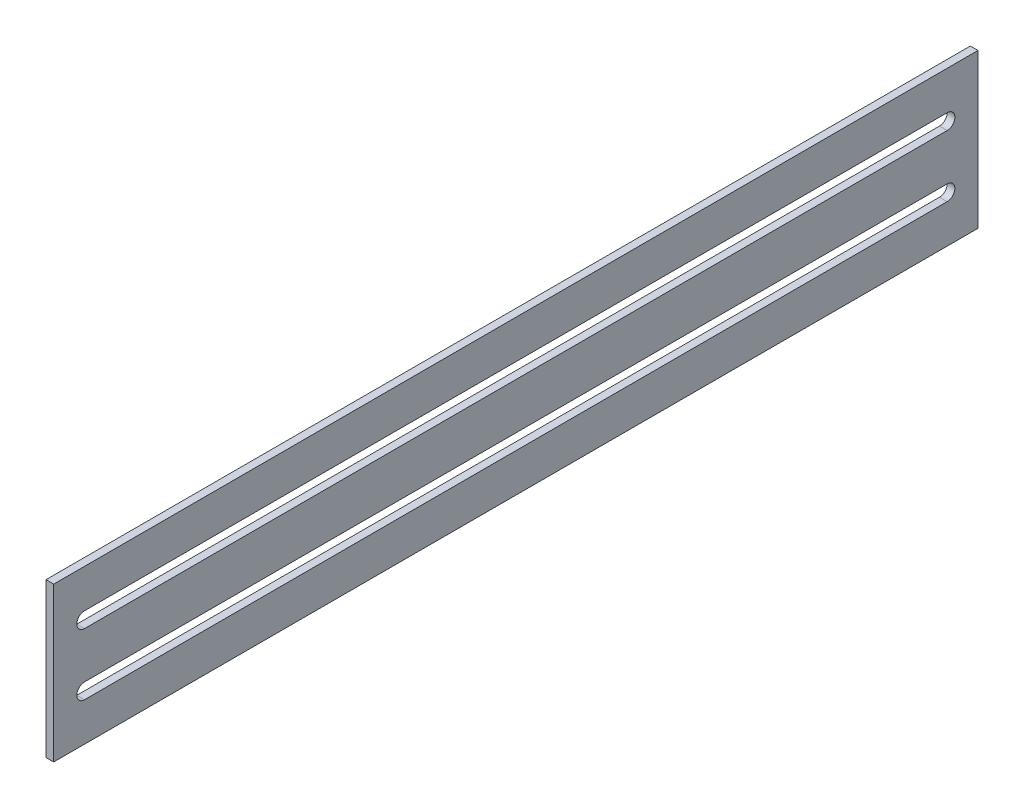
ISO-10303-21;
HEADER;
FILE_DESCRIPTION(('STEP AP214'),'2;1');
FILE_NAME('part.step','',(''),(''),'','','');
FILE_SCHEMA(('AUTOMOTIVE_DESIGN { 1 0 10303 214 1 1 1 1 }'));
ENDSEC;
DATA;
#1=APPLICATION_CONTEXT('core data for automotive mechanical design processes');
#2=APPLICATION_PROTOCOL_DEFINITION('international standard','automotive_design',2000,#1);
#3=PRODUCT_CONTEXT('',#1,'mechanical');
#4=PRODUCT('Part','Part','',(#3));
#5=PRODUCT_RELATED_PRODUCT_CATEGORY('part','',(#4));
#6=PRODUCT_DEFINITION_FORMATION('','',#4);
#7=PRODUCT_DEFINITION_CONTEXT('part definition',#1,'design');
#8=PRODUCT_DEFINITION('design','',#6,#7);
#9=PRODUCT_DEFINITION_SHAPE('','',#8);
#10=(LENGTH_UNIT() NAMED_UNIT(*) SI_UNIT(.MILLI.,.METRE.));
#11=(NAMED_UNIT(*) PLANE_ANGLE_UNIT() SI_UNIT($,.RADIAN.));
#12=(NAMED_UNIT(*) SI_UNIT($,.STERADIAN.) SOLID_ANGLE_UNIT());
#13=UNCERTAINTY_MEASURE_WITH_UNIT(LENGTH_MEASURE(1.E-05),#10,'distance_accuracy_value','');
#14=(GEOMETRIC_REPRESENTATION_CONTEXT(3) GLOBAL_UNCERTAINTY_ASSIGNED_CONTEXT((#13)) GLOBAL_UNIT_ASSIGNED_CONTEXT((#10,
#11,#12)) REPRESENTATION_CONTEXT('',''));
#15=CARTESIAN_POINT('',(0.,0.,0.));
#16=DIRECTION('',(0.,0.,1.));
#17=DIRECTION('',(1.,0.,0.));
#18=AXIS2_PLACEMENT_3D('',#15,#16,#17);
#19=CARTESIAN_POINT('',(1.5875,-31.75,-190.5));
#20=DIRECTION('',(0.,0.,1.));
#21=DIRECTION('',(1.,0.,0.));
#22=AXIS2_PLACEMENT_3D('',#19,#20,#21);
#23=PLANE('',#22);
#24=DIRECTION('',(0.,1.,0.));
#25=VECTOR('',#24,1.);
#26=CARTESIAN_POINT('',(-1.5875,-31.75,-190.5));
#27=LINE('',#26,#25);
#28=CARTESIAN_POINT('',(-1.5875,-31.75,-190.5));
#29=VERTEX_POINT('',#28);
#30=CARTESIAN_POINT('',(-1.5875,31.75,-190.5));
#31=VERTEX_POINT('',#30);
#32=EDGE_CURVE('E165',#29,#31,#27,.T.);
#33=ORIENTED_EDGE('',*,*,#32,.T.);
#34=DIRECTION('',(-1.,0.,0.));
#35=VECTOR('',#34,1.);
#36=CARTESIAN_POINT('',(1.5875,31.75,-190.5));
#37=LINE('',#36,#35);
#38=CARTESIAN_POINT('',(1.5875,31.75,-190.5));
#39=VERTEX_POINT('',#38);
#40=EDGE_CURVE('E11',#39,#31,#37,.T.);
#41=ORIENTED_EDGE('',*,*,#40,.F.);
#42=DIRECTION('',(0.,1.,0.));
#43=VECTOR('',#42,1.);
#44=CARTESIAN_POINT('',(1.5875,-31.75,-190.5));
#45=LINE('',#44,#43);
#46=CARTESIAN_POINT('',(1.5875,-31.75,-190.5));
#47=VERTEX_POINT('',#46);
#48=EDGE_CURVE('E199',#47,#39,#45,.T.);
#49=ORIENTED_EDGE('',*,*,#48,.F.);
#50=DIRECTION('',(-1.,0.,0.));
#51=VECTOR('',#50,1.);
#52=CARTESIAN_POINT('',(1.5875,-31.75,-190.5));
#53=LINE('',#52,#51);
#54=EDGE_CURVE('E209',#47,#29,#53,.T.);
#55=ORIENTED_EDGE('',*,*,#54,.T.);
#56=EDGE_LOOP('',(#33,#41,#49,#55));
#57=FACE_BOUND('',#56,.T.);
#58=ADVANCED_FACE('F41',(#57),#23,.F.);
#59=CARTESIAN_POINT('',(1.5875,31.75,190.5));
#60=DIRECTION('',(0.,-1.,0.));
#61=DIRECTION('',(0.,0.,-1.));
#62=AXIS2_PLACEMENT_3D('',#59,#60,#61);
#63=PLANE('',#62);
#64=DIRECTION('',(0.,0.,1.));
#65=VECTOR('',#64,1.);
#66=CARTESIAN_POINT('',(-1.5875,31.75,190.5));
#67=LINE('',#66,#65);
#68=CARTESIAN_POINT('',(-1.5875,31.75,190.5));
#69=VERTEX_POINT('',#68);
#70=EDGE_CURVE('E212',#31,#69,#67,.T.);
#71=ORIENTED_EDGE('',*,*,#70,.T.);
#72=DIRECTION('',(-1.,0.,0.));
#73=VECTOR('',#72,1.);
#74=CARTESIAN_POINT('',(1.5875,31.75,190.5));
#75=LINE('',#74,#73);
#76=CARTESIAN_POINT('',(1.5875,31.75,190.5));
#77=VERTEX_POINT('',#76);
#78=EDGE_CURVE('E48',#77,#69,#75,.T.);
#79=ORIENTED_EDGE('',*,*,#78,.F.);
#80=DIRECTION('',(0.,0.,1.));
#81=VECTOR('',#80,1.);
#82=CARTESIAN_POINT('',(1.5875,31.75,190.5));
#83=LINE('',#82,#81);
#84=EDGE_CURVE('E202',#39,#77,#83,.T.);
#85=ORIENTED_EDGE('',*,*,#84,.F.);
#86=ORIENTED_EDGE('',*,*,#40,.T.);
#87=EDGE_LOOP('',(#71,#79,#85,#86));
#88=FACE_BOUND('',#87,.T.);
#89=ADVANCED_FACE('F241',(#88),#63,.F.);
#90=CARTESIAN_POINT('',(1.5875,-31.75,190.5));
#91=DIRECTION('',(0.,0.,-1.));
#92=DIRECTION('',(-1.,0.,0.));
#93=AXIS2_PLACEMENT_3D('',#90,#91,#92);
#94=PLANE('',#93);
#95=DIRECTION('',(0.,-1.,0.));
#96=VECTOR('',#95,1.);
#97=CARTESIAN_POINT('',(-1.5875,-31.75,190.5));
#98=LINE('',#97,#96);
#99=CARTESIAN_POINT('',(-1.5875,-31.75,190.5));
#100=VERTEX_POINT('',#99);
#101=EDGE_CURVE('E214',#69,#100,#98,.T.);
#102=ORIENTED_EDGE('',*,*,#101,.T.);
#103=DIRECTION('',(-1.,0.,0.));
#104=VECTOR('',#103,1.);
#105=CARTESIAN_POINT('',(1.5875,-31.75,190.5));
#106=LINE('',#105,#104);
#107=CARTESIAN_POINT('',(1.5875,-31.75,190.5));
#108=VERTEX_POINT('',#107);
#109=EDGE_CURVE('E219',#108,#100,#106,.T.);
#110=ORIENTED_EDGE('',*,*,#109,.F.);
#111=DIRECTION('',(0.,-1.,0.));
#112=VECTOR('',#111,1.);
#113=CARTESIAN_POINT('',(1.5875,-31.75,190.5));
#114=LINE('',#113,#112);
#115=EDGE_CURVE('E205',#77,#108,#114,.T.);
#116=ORIENTED_EDGE('',*,*,#115,.F.);
#117=ORIENTED_EDGE('',*,*,#78,.T.);
#118=EDGE_LOOP('',(#102,#110,#116,#117));
#119=FACE_BOUND('',#118,.T.);
#120=ADVANCED_FACE('F226',(#119),#94,.F.);
#121=CARTESIAN_POINT('',(1.5875,-31.75,190.5));
#122=DIRECTION('',(0.,1.,0.));
#123=DIRECTION('',(0.,0.,1.));
#124=AXIS2_PLACEMENT_3D('',#121,#122,#123);
#125=PLANE('',#124);
#126=DIRECTION('',(0.,0.,-1.));
#127=VECTOR('',#126,1.);
#128=CARTESIAN_POINT('',(-1.5875,-31.75,190.5));
#129=LINE('',#128,#127);
#130=EDGE_CURVE('E203',#100,#29,#129,.T.);
#131=ORIENTED_EDGE('',*,*,#130,.T.);
#132=ORIENTED_EDGE('',*,*,#54,.F.);
#133=DIRECTION('',(0.,0.,-1.));
#134=VECTOR('',#133,1.);
#135=CARTESIAN_POINT('',(1.5875,-31.75,190.5));
#136=LINE('',#135,#134);
#137=EDGE_CURVE('E207',#108,#47,#136,.T.);
#138=ORIENTED_EDGE('',*,*,#137,.F.);
#139=ORIENTED_EDGE('',*,*,#109,.T.);
#140=EDGE_LOOP('',(#131,#132,#138,#139));
#141=FACE_BOUND('',#140,.T.);
#142=ADVANCED_FACE('F234',(#141),#125,.F.);
#143=CARTESIAN_POINT('',(1.5875,0.,0.));
#144=DIRECTION('',(-1.,0.,0.));
#145=DIRECTION('',(0.,0.,1.));
#146=AXIS2_PLACEMENT_3D('',#143,#144,#145);
#147=PLANE('',#146);
#148=DIRECTION('',(0.,0.,-1.));
#149=VECTOR('',#148,1.);
#150=CARTESIAN_POINT('',(1.5875,9.52500000000001,177.8));
#151=LINE('',#150,#149);
#152=CARTESIAN_POINT('',(1.5875,9.52500000000001,177.8));
#153=VERTEX_POINT('',#152);
#154=CARTESIAN_POINT('',(1.5875,9.52500000000001,-177.8));
#155=VERTEX_POINT('',#154);
#156=EDGE_CURVE('E159',#153,#155,#151,.T.);
#157=ORIENTED_EDGE('',*,*,#156,.F.);
#158=CARTESIAN_POINT('',(1.5875,12.7,177.8));
#159=DIRECTION('',(1.,0.,0.));
#160=DIRECTION('',(0.,0.,-1.));
#161=AXIS2_PLACEMENT_3D('',#158,#159,#160);
#162=CIRCLE('',#161,3.17499999999999);
#163=CARTESIAN_POINT('',(1.5875,15.875,177.8));
#164=VERTEX_POINT('',#163);
#165=EDGE_CURVE('E55',#164,#153,#162,.T.);
#166=ORIENTED_EDGE('',*,*,#165,.F.);
#167=DIRECTION('',(0.,0.,1.));
#168=VECTOR('',#167,1.);
#169=CARTESIAN_POINT('',(1.5875,15.875,177.8));
#170=LINE('',#169,#168);
#171=CARTESIAN_POINT('',(1.5875,15.875,-177.8));
#172=VERTEX_POINT('',#171);
#173=EDGE_CURVE('E150',#172,#164,#170,.T.);
#174=ORIENTED_EDGE('',*,*,#173,.F.);
#175=CARTESIAN_POINT('',(1.5875,12.7,-177.8));
#176=DIRECTION('',(1.,0.,0.));
#177=DIRECTION('',(0.,0.,-1.));
#178=AXIS2_PLACEMENT_3D('',#175,#176,#177);
#179=CIRCLE('',#178,3.17499999999999);
#180=EDGE_CURVE('E153',#155,#172,#179,.T.);
#181=ORIENTED_EDGE('',*,*,#180,.F.);
#182=EDGE_LOOP('',(#157,#166,#174,#181));
#183=FACE_BOUND('',#182,.T.);
#184=DIRECTION('',(0.,0.,-1.));
#185=VECTOR('',#184,1.);
#186=CARTESIAN_POINT('',(1.5875,-15.875,177.8));
#187=LINE('',#186,#185);
#188=CARTESIAN_POINT('',(1.5875,-15.875,177.8));
#189=VERTEX_POINT('',#188);
#190=CARTESIAN_POINT('',(1.5875,-15.875,-177.8));
#191=VERTEX_POINT('',#190);
#192=EDGE_CURVE('E185',#189,#191,#187,.T.);
#193=ORIENTED_EDGE('',*,*,#192,.F.);
#194=CARTESIAN_POINT('',(1.5875,-12.7,177.8));
#195=DIRECTION('',(1.,0.,0.));
#196=DIRECTION('',(0.,0.,1.));
#197=AXIS2_PLACEMENT_3D('',#194,#195,#196);
#198=CIRCLE('',#197,3.17499999999999);
#199=CARTESIAN_POINT('',(1.5875,-9.52500000000001,177.8));
#200=VERTEX_POINT('',#199);
#201=EDGE_CURVE('E63',#200,#189,#198,.T.);
#202=ORIENTED_EDGE('',*,*,#201,.F.);
#203=DIRECTION('',(0.,0.,1.));
#204=VECTOR('',#203,1.);
#205=CARTESIAN_POINT('',(1.5875,-9.52500000000001,177.8));
#206=LINE('',#205,#204);
#207=CARTESIAN_POINT('',(1.5875,-9.52500000000001,-177.8));
#208=VERTEX_POINT('',#207);
#209=EDGE_CURVE('E178',#208,#200,#206,.T.);
#210=ORIENTED_EDGE('',*,*,#209,.F.);
#211=CARTESIAN_POINT('',(1.5875,-12.7,-177.8));
#212=DIRECTION('',(1.,0.,0.));
#213=DIRECTION('',(0.,0.,1.));
#214=AXIS2_PLACEMENT_3D('',#211,#212,#213);
#215=CIRCLE('',#214,3.17499999999999);
#216=EDGE_CURVE('E181',#191,#208,#215,.T.);
#217=ORIENTED_EDGE('',*,*,#216,.F.);
#218=EDGE_LOOP('',(#193,#202,#210,#217));
#219=FACE_BOUND('',#218,.T.);
#220=ORIENTED_EDGE('',*,*,#48,.T.);
#221=ORIENTED_EDGE('',*,*,#84,.T.);
#222=ORIENTED_EDGE('',*,*,#115,.T.);
#223=ORIENTED_EDGE('',*,*,#137,.T.);
#224=EDGE_LOOP('',(#220,#221,#222,#223));
#225=FACE_BOUND('',#224,.T.);
#226=ADVANCED_FACE('F240',(#183,#219,#225),#147,.F.);
#227=CARTESIAN_POINT('',(-1.5875,0.,0.));
#228=DIRECTION('',(-1.,0.,0.));
#229=DIRECTION('',(0.,0.,1.));
#230=AXIS2_PLACEMENT_3D('',#227,#228,#229);
#231=PLANE('',#230);
#232=CARTESIAN_POINT('',(-1.5875,12.7,177.8));
#233=DIRECTION('',(1.,0.,0.));
#234=DIRECTION('',(0.,0.,-1.));
#235=AXIS2_PLACEMENT_3D('',#232,#233,#234);
#236=CIRCLE('',#235,3.17499999999999);
#237=CARTESIAN_POINT('',(-1.5875,15.875,177.8));
#238=VERTEX_POINT('',#237);
#239=CARTESIAN_POINT('',(-1.5875,9.52500000000001,177.8));
#240=VERTEX_POINT('',#239);
#241=EDGE_CURVE('E131',#238,#240,#236,.T.);
#242=ORIENTED_EDGE('',*,*,#241,.T.);
#243=DIRECTION('',(0.,0.,-1.));
#244=VECTOR('',#243,1.);
#245=CARTESIAN_POINT('',(-1.5875,9.52500000000001,177.8));
#246=LINE('',#245,#244);
#247=CARTESIAN_POINT('',(-1.5875,9.52500000000001,-177.8));
#248=VERTEX_POINT('',#247);
#249=EDGE_CURVE('E141',#240,#248,#246,.T.);
#250=ORIENTED_EDGE('',*,*,#249,.T.);
#251=CARTESIAN_POINT('',(-1.5875,12.7,-177.8));
#252=DIRECTION('',(1.,0.,0.));
#253=DIRECTION('',(0.,0.,-1.));
#254=AXIS2_PLACEMENT_3D('',#251,#252,#253);
#255=CIRCLE('',#254,3.17499999999999);
#256=CARTESIAN_POINT('',(-1.5875,15.875,-177.8));
#257=VERTEX_POINT('',#256);
#258=EDGE_CURVE('E145',#248,#257,#255,.T.);
#259=ORIENTED_EDGE('',*,*,#258,.T.);
#260=DIRECTION('',(0.,0.,1.));
#261=VECTOR('',#260,1.);
#262=CARTESIAN_POINT('',(-1.5875,15.875,177.8));
#263=LINE('',#262,#261);
#264=EDGE_CURVE('E137',#257,#238,#263,.T.);
#265=ORIENTED_EDGE('',*,*,#264,.T.);
#266=EDGE_LOOP('',(#242,#250,#259,#265));
#267=FACE_BOUND('',#266,.T.);
#268=CARTESIAN_POINT('',(-1.5875,-12.7,177.8));
#269=DIRECTION('',(1.,0.,0.));
#270=DIRECTION('',(0.,0.,1.));
#271=AXIS2_PLACEMENT_3D('',#268,#269,#270);
#272=CIRCLE('',#271,3.17499999999999);
#273=CARTESIAN_POINT('',(-1.5875,-9.52500000000001,177.8));
#274=VERTEX_POINT('',#273);
#275=CARTESIAN_POINT('',(-1.5875,-15.875,177.8));
#276=VERTEX_POINT('',#275);
#277=EDGE_CURVE('E182',#274,#276,#272,.T.);
#278=ORIENTED_EDGE('',*,*,#277,.T.);
#279=DIRECTION('',(0.,0.,-1.));
#280=VECTOR('',#279,1.);
#281=CARTESIAN_POINT('',(-1.5875,-15.875,177.8));
#282=LINE('',#281,#280);
#283=CARTESIAN_POINT('',(-1.5875,-15.875,-177.8));
#284=VERTEX_POINT('',#283);
#285=EDGE_CURVE('E194',#276,#284,#282,.T.);
#286=ORIENTED_EDGE('',*,*,#285,.T.);
#287=CARTESIAN_POINT('',(-1.5875,-12.7,-177.8));
#288=DIRECTION('',(1.,0.,0.));
#289=DIRECTION('',(0.,0.,1.));
#290=AXIS2_PLACEMENT_3D('',#287,#288,#289);
#291=CIRCLE('',#290,3.17499999999999);
#292=CARTESIAN_POINT('',(-1.5875,-9.52500000000001,-177.8));
#293=VERTEX_POINT('',#292);
#294=EDGE_CURVE('E191',#284,#293,#291,.T.);
#295=ORIENTED_EDGE('',*,*,#294,.T.);
#296=DIRECTION('',(0.,0.,1.));
#297=VECTOR('',#296,1.);
#298=CARTESIAN_POINT('',(-1.5875,-9.52500000000001,177.8));
#299=LINE('',#298,#297);
#300=EDGE_CURVE('E171',#293,#274,#299,.T.);
#301=ORIENTED_EDGE('',*,*,#300,.T.);
#302=EDGE_LOOP('',(#278,#286,#295,#301));
#303=FACE_BOUND('',#302,.T.);
#304=ORIENTED_EDGE('',*,*,#32,.F.);
#305=ORIENTED_EDGE('',*,*,#130,.F.);
#306=ORIENTED_EDGE('',*,*,#101,.F.);
#307=ORIENTED_EDGE('',*,*,#70,.F.);
#308=EDGE_LOOP('',(#304,#305,#306,#307));
#309=FACE_BOUND('',#308,.T.);
#310=ADVANCED_FACE('F147',(#267,#303,#309),#231,.T.);
#311=CARTESIAN_POINT('',(-1.5875,-12.7,177.8));
#312=DIRECTION('',(1.,0.,0.));
#313=DIRECTION('',(0.,0.,-1.));
#314=AXIS2_PLACEMENT_3D('',#311,#312,#313);
#315=CYLINDRICAL_SURFACE('',#314,3.17499999999999);
#316=ORIENTED_EDGE('',*,*,#201,.T.);
#317=DIRECTION('',(1.,0.,0.));
#318=VECTOR('',#317,1.);
#319=CARTESIAN_POINT('',(-1.5875,-15.875,177.8));
#320=LINE('',#319,#318);
#321=EDGE_CURVE('E169',#276,#189,#320,.T.);
#322=ORIENTED_EDGE('',*,*,#321,.F.);
#323=ORIENTED_EDGE('',*,*,#277,.F.);
#324=DIRECTION('',(1.,0.,0.));
#325=VECTOR('',#324,1.);
#326=CARTESIAN_POINT('',(-1.5875,-9.52500000000001,177.8));
#327=LINE('',#326,#325);
#328=EDGE_CURVE('E176',#274,#200,#327,.T.);
#329=ORIENTED_EDGE('',*,*,#328,.T.);
#330=EDGE_LOOP('',(#316,#322,#323,#329));
#331=FACE_BOUND('',#330,.T.);
#332=ADVANCED_FACE('F253',(#331),#315,.F.);
#333=CARTESIAN_POINT('',(-1.5875,-9.52500000000001,177.8));
#334=DIRECTION('',(0.,1.,0.));
#335=DIRECTION('',(0.,0.,1.));
#336=AXIS2_PLACEMENT_3D('',#333,#334,#335);
#337=PLANE('',#336);
#338=ORIENTED_EDGE('',*,*,#209,.T.);
#339=ORIENTED_EDGE('',*,*,#328,.F.);
#340=ORIENTED_EDGE('',*,*,#300,.F.);
#341=DIRECTION('',(1.,0.,0.));
#342=VECTOR('',#341,1.);
#343=CARTESIAN_POINT('',(-1.5875,-9.52500000000001,-177.8));
#344=LINE('',#343,#342);
#345=EDGE_CURVE('E174',#293,#208,#344,.T.);
#346=ORIENTED_EDGE('',*,*,#345,.T.);
#347=EDGE_LOOP('',(#338,#339,#340,#346));
#348=FACE_BOUND('',#347,.T.);
#349=ADVANCED_FACE('F257',(#348),#337,.F.);
#350=CARTESIAN_POINT('',(-1.5875,-12.7,-177.8));
#351=DIRECTION('',(1.,0.,0.));
#352=DIRECTION('',(0.,0.,-1.));
#353=AXIS2_PLACEMENT_3D('',#350,#351,#352);
#354=CYLINDRICAL_SURFACE('',#353,3.17499999999999);
#355=ORIENTED_EDGE('',*,*,#216,.T.);
#356=ORIENTED_EDGE('',*,*,#345,.F.);
#357=ORIENTED_EDGE('',*,*,#294,.F.);
#358=DIRECTION('',(1.,0.,0.));
#359=VECTOR('',#358,1.);
#360=CARTESIAN_POINT('',(-1.5875,-15.875,-177.8));
#361=LINE('',#360,#359);
#362=EDGE_CURVE('E172',#284,#191,#361,.T.);
#363=ORIENTED_EDGE('',*,*,#362,.T.);
#364=EDGE_LOOP('',(#355,#356,#357,#363));
#365=FACE_BOUND('',#364,.T.);
#366=ADVANCED_FACE('F260',(#365),#354,.F.);
#367=CARTESIAN_POINT('',(-1.5875,-15.875,177.8));
#368=DIRECTION('',(0.,-1.,0.));
#369=DIRECTION('',(0.,0.,-1.));
#370=AXIS2_PLACEMENT_3D('',#367,#368,#369);
#371=PLANE('',#370);
#372=ORIENTED_EDGE('',*,*,#192,.T.);
#373=ORIENTED_EDGE('',*,*,#362,.F.);
#374=ORIENTED_EDGE('',*,*,#285,.F.);
#375=ORIENTED_EDGE('',*,*,#321,.T.);
#376=EDGE_LOOP('',(#372,#373,#374,#375));
#377=FACE_BOUND('',#376,.T.);
#378=ADVANCED_FACE('F264',(#377),#371,.F.);
#379=CARTESIAN_POINT('',(-1.5875,12.7,177.8));
#380=DIRECTION('',(1.,0.,0.));
#381=DIRECTION('',(0.,0.,-1.));
#382=AXIS2_PLACEMENT_3D('',#379,#380,#381);
#383=CYLINDRICAL_SURFACE('',#382,3.17499999999999);
#384=ORIENTED_EDGE('',*,*,#165,.T.);
#385=DIRECTION('',(1.,0.,0.));
#386=VECTOR('',#385,1.);
#387=CARTESIAN_POINT('',(-1.5875,9.52500000000001,177.8));
#388=LINE('',#387,#386);
#389=EDGE_CURVE('E127',#240,#153,#388,.T.);
#390=ORIENTED_EDGE('',*,*,#389,.F.);
#391=ORIENTED_EDGE('',*,*,#241,.F.);
#392=DIRECTION('',(1.,0.,0.));
#393=VECTOR('',#392,1.);
#394=CARTESIAN_POINT('',(-1.5875,15.875,177.8));
#395=LINE('',#394,#393);
#396=EDGE_CURVE('E163',#238,#164,#395,.T.);
#397=ORIENTED_EDGE('',*,*,#396,.T.);
#398=EDGE_LOOP('',(#384,#390,#391,#397));
#399=FACE_BOUND('',#398,.T.);
#400=ADVANCED_FACE('F129',(#399),#383,.F.);
#401=CARTESIAN_POINT('',(-1.5875,15.875,177.8));
#402=DIRECTION('',(0.,1.,0.));
#403=DIRECTION('',(0.,0.,1.));
#404=AXIS2_PLACEMENT_3D('',#401,#402,#403);
#405=PLANE('',#404);
#406=ORIENTED_EDGE('',*,*,#173,.T.);
#407=ORIENTED_EDGE('',*,*,#396,.F.);
#408=ORIENTED_EDGE('',*,*,#264,.F.);
#409=DIRECTION('',(1.,0.,0.));
#410=VECTOR('',#409,1.);
#411=CARTESIAN_POINT('',(-1.5875,15.875,-177.8));
#412=LINE('',#411,#410);
#413=EDGE_CURVE('E166',#257,#172,#412,.T.);
#414=ORIENTED_EDGE('',*,*,#413,.T.);
#415=EDGE_LOOP('',(#406,#407,#408,#414));
#416=FACE_BOUND('',#415,.T.);
#417=ADVANCED_FACE('F273',(#416),#405,.F.);
#418=CARTESIAN_POINT('',(-1.5875,12.7,-177.8));
#419=DIRECTION('',(1.,0.,0.));
#420=DIRECTION('',(0.,0.,-1.));
#421=AXIS2_PLACEMENT_3D('',#418,#419,#420);
#422=CYLINDRICAL_SURFACE('',#421,3.17499999999999);
#423=ORIENTED_EDGE('',*,*,#180,.T.);
#424=ORIENTED_EDGE('',*,*,#413,.F.);
#425=ORIENTED_EDGE('',*,*,#258,.F.);
#426=DIRECTION('',(1.,0.,0.));
#427=VECTOR('',#426,1.);
#428=CARTESIAN_POINT('',(-1.5875,9.52500000000001,-177.8));
#429=LINE('',#428,#427);
#430=EDGE_CURVE('E136',#248,#155,#429,.T.);
#431=ORIENTED_EDGE('',*,*,#430,.T.);
#432=EDGE_LOOP('',(#423,#424,#425,#431));
#433=FACE_BOUND('',#432,.T.);
#434=ADVANCED_FACE('F276',(#433),#422,.F.);
#435=CARTESIAN_POINT('',(-1.5875,9.52500000000001,177.8));
#436=DIRECTION('',(0.,-1.,0.));
#437=DIRECTION('',(0.,0.,-1.));
#438=AXIS2_PLACEMENT_3D('',#435,#436,#437);
#439=PLANE('',#438);
#440=ORIENTED_EDGE('',*,*,#156,.T.);
#441=ORIENTED_EDGE('',*,*,#430,.F.);
#442=ORIENTED_EDGE('',*,*,#249,.F.);
#443=ORIENTED_EDGE('',*,*,#389,.T.);
#444=EDGE_LOOP('',(#440,#441,#442,#443));
#445=FACE_BOUND('',#444,.T.);
#446=ADVANCED_FACE('F142',(#445),#439,.F.);
#447=CLOSED_SHELL('',(#58,#89,#120,#142,#226,#310,#332,#349,#366,#378,#400,#417,#434,#446));
#448=MANIFOLD_SOLID_BREP('B2',#447);
#449=ADVANCED_BREP_SHAPE_REPRESENTATION('',(#18,#448),#14);
#450=SHAPE_DEFINITION_REPRESENTATION(#9,#449);
ENDSEC;
END-ISO-10303-21;
